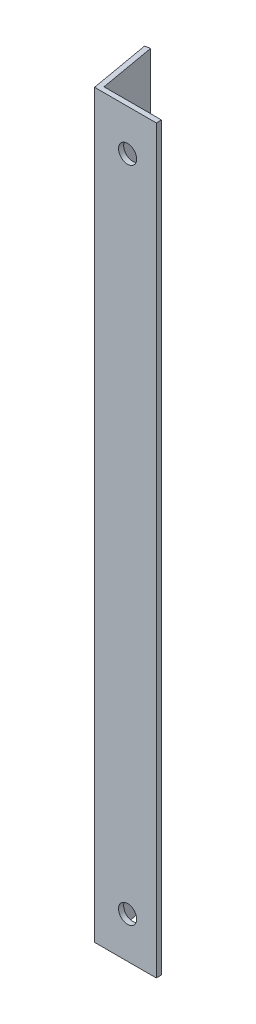
ISO-10303-21;
HEADER;
FILE_DESCRIPTION(('STEP AP214'),'2;1');
FILE_NAME('part.step','',(''),(''),'','','');
FILE_SCHEMA(('AUTOMOTIVE_DESIGN { 1 0 10303 214 1 1 1 1 }'));
ENDSEC;
DATA;
#1=APPLICATION_CONTEXT('core data for automotive mechanical design processes');
#2=APPLICATION_PROTOCOL_DEFINITION('international standard','automotive_design',2000,#1);
#3=PRODUCT_CONTEXT('',#1,'mechanical');
#4=PRODUCT('Part','Part','',(#3));
#5=PRODUCT_RELATED_PRODUCT_CATEGORY('part','',(#4));
#6=PRODUCT_DEFINITION_FORMATION('','',#4);
#7=PRODUCT_DEFINITION_CONTEXT('part definition',#1,'design');
#8=PRODUCT_DEFINITION('design','',#6,#7);
#9=PRODUCT_DEFINITION_SHAPE('','',#8);
#10=(LENGTH_UNIT() NAMED_UNIT(*) SI_UNIT(.MILLI.,.METRE.));
#11=(NAMED_UNIT(*) PLANE_ANGLE_UNIT() SI_UNIT($,.RADIAN.));
#12=(NAMED_UNIT(*) SI_UNIT($,.STERADIAN.) SOLID_ANGLE_UNIT());
#13=UNCERTAINTY_MEASURE_WITH_UNIT(LENGTH_MEASURE(1.E-05),#10,'distance_accuracy_value','');
#14=(GEOMETRIC_REPRESENTATION_CONTEXT(3) GLOBAL_UNCERTAINTY_ASSIGNED_CONTEXT((#13)) GLOBAL_UNIT_ASSIGNED_CONTEXT((#10,
#11,#12)) REPRESENTATION_CONTEXT('',''));
#15=CARTESIAN_POINT('',(0.,0.,0.));
#16=DIRECTION('',(0.,0.,1.));
#17=DIRECTION('',(1.,0.,0.));
#18=AXIS2_PLACEMENT_3D('',#15,#16,#17);
#19=CARTESIAN_POINT('',(0.,228.6,0.));
#20=DIRECTION('',(0.984807753012209,0.,-0.173648177666927));
#21=DIRECTION('',(-0.173648177666927,0.,-0.984807753012209));
#22=AXIS2_PLACEMENT_3D('',#19,#20,#21);
#23=PLANE('',#22);
#24=DIRECTION('',(0.173648177666927,0.,0.984807753012209));
#25=VECTOR('',#24,1.);
#26=CARTESIAN_POINT('',(0.,-228.6,0.));
#27=LINE('',#26,#25);
#28=CARTESIAN_POINT('',(-6.61599556910993,-228.6,-37.5211753897651));
#29=VERTEX_POINT('',#28);
#30=CARTESIAN_POINT('',(0.,-228.6,0.));
#31=VERTEX_POINT('',#30);
#32=EDGE_CURVE('E117',#29,#31,#27,.T.);
#33=ORIENTED_EDGE('',*,*,#32,.T.);
#34=DIRECTION('',(0.,-1.,0.));
#35=VECTOR('',#34,1.);
#36=CARTESIAN_POINT('',(0.,228.6,0.));
#37=LINE('',#36,#35);
#38=CARTESIAN_POINT('',(0.,228.6,0.));
#39=VERTEX_POINT('',#38);
#40=EDGE_CURVE('E11',#39,#31,#37,.T.);
#41=ORIENTED_EDGE('',*,*,#40,.F.);
#42=DIRECTION('',(0.173648177666927,0.,0.984807753012209));
#43=VECTOR('',#42,1.);
#44=CARTESIAN_POINT('',(0.,228.6,0.));
#45=LINE('',#44,#43);
#46=CARTESIAN_POINT('',(-6.61599556910993,228.6,-37.5211753897651));
#47=VERTEX_POINT('',#46);
#48=EDGE_CURVE('E128',#47,#39,#45,.T.);
#49=ORIENTED_EDGE('',*,*,#48,.F.);
#50=DIRECTION('',(0.,-1.,0.));
#51=VECTOR('',#50,1.);
#52=CARTESIAN_POINT('',(-6.61599556910993,228.6,-37.5211753897651));
#53=LINE('',#52,#51);
#54=EDGE_CURVE('E113',#47,#29,#53,.T.);
#55=ORIENTED_EDGE('',*,*,#54,.T.);
#56=EDGE_LOOP('',(#33,#41,#49,#55));
#57=FACE_BOUND('',#56,.T.);
#58=ADVANCED_FACE('F33',(#57),#23,.F.);
#59=CARTESIAN_POINT('',(0.,228.6,0.));
#60=DIRECTION('',(0.,0.,-1.));
#61=DIRECTION('',(-1.,0.,0.));
#62=AXIS2_PLACEMENT_3D('',#59,#60,#61);
#63=PLANE('',#62);
#64=CARTESIAN_POINT('',(20.3820706644939,-203.2,0.));
#65=DIRECTION('',(0.,0.,1.));
#66=DIRECTION('',(-1.,0.,0.));
#67=AXIS2_PLACEMENT_3D('',#64,#65,#66);
#68=CIRCLE('',#67,5.58799999999991);
#69=CARTESIAN_POINT('',(14.794070664494,-203.2,0.));
#70=VERTEX_POINT('',#69);
#71=EDGE_CURVE('E176',#70,#70,#68,.T.);
#72=ORIENTED_EDGE('',*,*,#71,.F.);
#73=EDGE_LOOP('',(#72));
#74=FACE_BOUND('',#73,.T.);
#75=CARTESIAN_POINT('',(20.3820706644939,203.2,0.));
#76=DIRECTION('',(0.,0.,-1.));
#77=DIRECTION('',(-1.,0.,0.));
#78=AXIS2_PLACEMENT_3D('',#75,#76,#77);
#79=CIRCLE('',#78,5.58799999999991);
#80=CARTESIAN_POINT('',(14.794070664494,203.2,0.));
#81=VERTEX_POINT('',#80);
#82=EDGE_CURVE('E121',#81,#81,#79,.T.);
#83=ORIENTED_EDGE('',*,*,#82,.T.);
#84=EDGE_LOOP('',(#83));
#85=FACE_BOUND('',#84,.T.);
#86=DIRECTION('',(1.,0.,0.));
#87=VECTOR('',#86,1.);
#88=CARTESIAN_POINT('',(0.,-228.6,0.));
#89=LINE('',#88,#87);
#90=CARTESIAN_POINT('',(38.1,-228.6,0.));
#91=VERTEX_POINT('',#90);
#92=EDGE_CURVE('E120',#31,#91,#89,.T.);
#93=ORIENTED_EDGE('',*,*,#92,.T.);
#94=DIRECTION('',(0.,-1.,0.));
#95=VECTOR('',#94,1.);
#96=CARTESIAN_POINT('',(38.1,228.6,0.));
#97=LINE('',#96,#95);
#98=CARTESIAN_POINT('',(38.1,228.6,0.));
#99=VERTEX_POINT('',#98);
#100=EDGE_CURVE('E41',#99,#91,#97,.T.);
#101=ORIENTED_EDGE('',*,*,#100,.F.);
#102=DIRECTION('',(1.,0.,0.));
#103=VECTOR('',#102,1.);
#104=CARTESIAN_POINT('',(0.,228.6,0.));
#105=LINE('',#104,#103);
#106=EDGE_CURVE('E86',#39,#99,#105,.T.);
#107=ORIENTED_EDGE('',*,*,#106,.F.);
#108=ORIENTED_EDGE('',*,*,#40,.T.);
#109=EDGE_LOOP('',(#93,#101,#107,#108));
#110=FACE_BOUND('',#109,.T.);
#111=ADVANCED_FACE('F152',(#74,#85,#110),#63,.F.);
#112=CARTESIAN_POINT('',(38.1,228.6,0.));
#113=DIRECTION('',(-1.,0.,0.));
#114=DIRECTION('',(0.,0.,1.));
#115=AXIS2_PLACEMENT_3D('',#112,#113,#114);
#116=PLANE('',#115);
#117=DIRECTION('',(0.,0.,-1.));
#118=VECTOR('',#117,1.);
#119=CARTESIAN_POINT('',(38.1,-228.6,0.));
#120=LINE('',#119,#118);
#121=CARTESIAN_POINT('',(38.1,-228.6,-3.175));
#122=VERTEX_POINT('',#121);
#123=EDGE_CURVE('E123',#91,#122,#120,.T.);
#124=ORIENTED_EDGE('',*,*,#123,.T.);
#125=DIRECTION('',(0.,-1.,0.));
#126=VECTOR('',#125,1.);
#127=CARTESIAN_POINT('',(38.1,228.6,-3.175));
#128=LINE('',#127,#126);
#129=CARTESIAN_POINT('',(38.1,228.6,-3.175));
#130=VERTEX_POINT('',#129);
#131=EDGE_CURVE('E108',#130,#122,#128,.T.);
#132=ORIENTED_EDGE('',*,*,#131,.F.);
#133=DIRECTION('',(0.,0.,-1.));
#134=VECTOR('',#133,1.);
#135=CARTESIAN_POINT('',(38.1,228.6,0.));
#136=LINE('',#135,#134);
#137=EDGE_CURVE('E99',#99,#130,#136,.T.);
#138=ORIENTED_EDGE('',*,*,#137,.F.);
#139=ORIENTED_EDGE('',*,*,#100,.T.);
#140=EDGE_LOOP('',(#124,#132,#138,#139));
#141=FACE_BOUND('',#140,.T.);
#142=ADVANCED_FACE('F134',(#141),#116,.F.);
#143=CARTESIAN_POINT('',(2.66414132898787,228.6,-3.175));
#144=DIRECTION('',(0.,0.,1.));
#145=DIRECTION('',(1.,0.,0.));
#146=AXIS2_PLACEMENT_3D('',#143,#144,#145);
#147=PLANE('',#146);
#148=CARTESIAN_POINT('',(20.3820706644939,-203.2,-3.175));
#149=DIRECTION('',(0.,0.,1.));
#150=DIRECTION('',(-1.,0.,0.));
#151=AXIS2_PLACEMENT_3D('',#148,#149,#150);
#152=CIRCLE('',#151,5.58799999999991);
#153=CARTESIAN_POINT('',(14.794070664494,-203.2,-3.175));
#154=VERTEX_POINT('',#153);
#155=EDGE_CURVE('E171',#154,#154,#152,.T.);
#156=ORIENTED_EDGE('',*,*,#155,.T.);
#157=EDGE_LOOP('',(#156));
#158=FACE_BOUND('',#157,.T.);
#159=CARTESIAN_POINT('',(20.3820706644939,203.2,-3.175));
#160=DIRECTION('',(0.,0.,-1.));
#161=DIRECTION('',(-1.,0.,0.));
#162=AXIS2_PLACEMENT_3D('',#159,#160,#161);
#163=CIRCLE('',#162,5.58799999999991);
#164=CARTESIAN_POINT('',(14.794070664494,203.2,-3.175));
#165=VERTEX_POINT('',#164);
#166=EDGE_CURVE('E174',#165,#165,#163,.T.);
#167=ORIENTED_EDGE('',*,*,#166,.F.);
#168=EDGE_LOOP('',(#167));
#169=FACE_BOUND('',#168,.T.);
#170=DIRECTION('',(-1.,0.,0.));
#171=VECTOR('',#170,1.);
#172=CARTESIAN_POINT('',(2.66414132898787,-228.6,-3.175));
#173=LINE('',#172,#171);
#174=CARTESIAN_POINT('',(2.66414132898787,-228.6,-3.175));
#175=VERTEX_POINT('',#174);
#176=EDGE_CURVE('E107',#122,#175,#173,.T.);
#177=ORIENTED_EDGE('',*,*,#176,.T.);
#178=DIRECTION('',(0.,-1.,0.));
#179=VECTOR('',#178,1.);
#180=CARTESIAN_POINT('',(2.66414132898787,228.6,-3.175));
#181=LINE('',#180,#179);
#182=CARTESIAN_POINT('',(2.66414132898787,228.6,-3.175));
#183=VERTEX_POINT('',#182);
#184=EDGE_CURVE('E104',#183,#175,#181,.T.);
#185=ORIENTED_EDGE('',*,*,#184,.F.);
#186=DIRECTION('',(-1.,0.,0.));
#187=VECTOR('',#186,1.);
#188=CARTESIAN_POINT('',(2.66414132898787,228.6,-3.175));
#189=LINE('',#188,#187);
#190=EDGE_CURVE('E93',#130,#183,#189,.T.);
#191=ORIENTED_EDGE('',*,*,#190,.F.);
#192=ORIENTED_EDGE('',*,*,#131,.T.);
#193=EDGE_LOOP('',(#177,#185,#191,#192));
#194=FACE_BOUND('',#193,.T.);
#195=ADVANCED_FACE('F105',(#158,#169,#194),#147,.F.);
#196=CARTESIAN_POINT('',(-3.48923095329616,228.6,-38.0725083538576));
#197=DIRECTION('',(-0.984807753012208,0.,0.173648177666927));
#198=DIRECTION('',(0.173648177666927,0.,0.984807753012209));
#199=AXIS2_PLACEMENT_3D('',#196,#197,#198);
#200=PLANE('',#199);
#201=DIRECTION('',(-0.173648177666927,0.,-0.984807753012209));
#202=VECTOR('',#201,1.);
#203=CARTESIAN_POINT('',(-3.48923095329616,-228.6,-38.0725083538576));
#204=LINE('',#203,#202);
#205=CARTESIAN_POINT('',(-3.48923095329616,-228.6,-38.0725083538576));
#206=VERTEX_POINT('',#205);
#207=EDGE_CURVE('E72',#175,#206,#204,.T.);
#208=ORIENTED_EDGE('',*,*,#207,.T.);
#209=DIRECTION('',(0.,-1.,0.));
#210=VECTOR('',#209,1.);
#211=CARTESIAN_POINT('',(-3.48923095329616,228.6,-38.0725083538576));
#212=LINE('',#211,#210);
#213=CARTESIAN_POINT('',(-3.48923095329616,228.6,-38.0725083538576));
#214=VERTEX_POINT('',#213);
#215=EDGE_CURVE('E109',#214,#206,#212,.T.);
#216=ORIENTED_EDGE('',*,*,#215,.F.);
#217=DIRECTION('',(-0.173648177666927,0.,-0.984807753012209));
#218=VECTOR('',#217,1.);
#219=CARTESIAN_POINT('',(-3.48923095329616,228.6,-38.0725083538576));
#220=LINE('',#219,#218);
#221=EDGE_CURVE('E97',#183,#214,#220,.T.);
#222=ORIENTED_EDGE('',*,*,#221,.F.);
#223=ORIENTED_EDGE('',*,*,#184,.T.);
#224=EDGE_LOOP('',(#208,#216,#222,#223));
#225=FACE_BOUND('',#224,.T.);
#226=ADVANCED_FACE('F111',(#225),#200,.F.);
#227=CARTESIAN_POINT('',(-6.61599556910993,228.6,-37.5211753897651));
#228=DIRECTION('',(0.173648177666928,0.,0.984807753012209));
#229=DIRECTION('',(0.984807753012209,0.,-0.173648177666928));
#230=AXIS2_PLACEMENT_3D('',#227,#228,#229);
#231=PLANE('',#230);
#232=DIRECTION('',(-0.984807753012209,0.,0.173648177666928));
#233=VECTOR('',#232,1.);
#234=CARTESIAN_POINT('',(-6.61599556910993,-228.6,-37.5211753897651));
#235=LINE('',#234,#233);
#236=EDGE_CURVE('E78',#206,#29,#235,.T.);
#237=ORIENTED_EDGE('',*,*,#236,.T.);
#238=ORIENTED_EDGE('',*,*,#54,.F.);
#239=DIRECTION('',(-0.984807753012209,0.,0.173648177666928));
#240=VECTOR('',#239,1.);
#241=CARTESIAN_POINT('',(-6.61599556910993,228.6,-37.5211753897651));
#242=LINE('',#241,#240);
#243=EDGE_CURVE('E49',#214,#47,#242,.T.);
#244=ORIENTED_EDGE('',*,*,#243,.F.);
#245=ORIENTED_EDGE('',*,*,#215,.T.);
#246=EDGE_LOOP('',(#237,#238,#244,#245));
#247=FACE_BOUND('',#246,.T.);
#248=ADVANCED_FACE('F141',(#247),#231,.F.);
#249=CARTESIAN_POINT('',(0.,228.6,0.));
#250=DIRECTION('',(0.,-1.,0.));
#251=DIRECTION('',(0.,0.,-1.));
#252=AXIS2_PLACEMENT_3D('',#249,#250,#251);
#253=PLANE('',#252);
#254=ORIENTED_EDGE('',*,*,#48,.T.);
#255=ORIENTED_EDGE('',*,*,#106,.T.);
#256=ORIENTED_EDGE('',*,*,#137,.T.);
#257=ORIENTED_EDGE('',*,*,#190,.T.);
#258=ORIENTED_EDGE('',*,*,#221,.T.);
#259=ORIENTED_EDGE('',*,*,#243,.T.);
#260=EDGE_LOOP('',(#254,#255,#256,#257,#258,#259));
#261=FACE_BOUND('',#260,.T.);
#262=ADVANCED_FACE('F95',(#261),#253,.F.);
#263=CARTESIAN_POINT('',(0.,-228.6,0.));
#264=DIRECTION('',(0.,-1.,0.));
#265=DIRECTION('',(0.,0.,-1.));
#266=AXIS2_PLACEMENT_3D('',#263,#264,#265);
#267=PLANE('',#266);
#268=ORIENTED_EDGE('',*,*,#32,.F.);
#269=ORIENTED_EDGE('',*,*,#236,.F.);
#270=ORIENTED_EDGE('',*,*,#207,.F.);
#271=ORIENTED_EDGE('',*,*,#176,.F.);
#272=ORIENTED_EDGE('',*,*,#123,.F.);
#273=ORIENTED_EDGE('',*,*,#92,.F.);
#274=EDGE_LOOP('',(#268,#269,#270,#271,#272,#273));
#275=FACE_BOUND('',#274,.T.);
#276=ADVANCED_FACE('F137',(#275),#267,.T.);
#277=CARTESIAN_POINT('',(20.3820706644939,203.2,0.));
#278=DIRECTION('',(0.,0.,-1.));
#279=DIRECTION('',(-1.,0.,0.));
#280=AXIS2_PLACEMENT_3D('',#277,#278,#279);
#281=CYLINDRICAL_SURFACE('',#280,5.58799999999991);
#282=ORIENTED_EDGE('',*,*,#82,.F.);
#283=EDGE_LOOP('',(#282));
#284=FACE_BOUND('',#283,.T.);
#285=ORIENTED_EDGE('',*,*,#166,.T.);
#286=EDGE_LOOP('',(#285));
#287=FACE_BOUND('',#286,.T.);
#288=ADVANCED_FACE('F189',(#284,#287),#281,.F.);
#289=CARTESIAN_POINT('',(20.3820706644939,-203.2,0.));
#290=DIRECTION('',(0.,0.,-1.));
#291=DIRECTION('',(-1.,0.,0.));
#292=AXIS2_PLACEMENT_3D('',#289,#290,#291);
#293=CYLINDRICAL_SURFACE('',#292,5.58799999999991);
#294=ORIENTED_EDGE('',*,*,#71,.T.);
#295=EDGE_LOOP('',(#294));
#296=FACE_BOUND('',#295,.T.);
#297=ORIENTED_EDGE('',*,*,#155,.F.);
#298=EDGE_LOOP('',(#297));
#299=FACE_BOUND('',#298,.T.);
#300=ADVANCED_FACE('F186',(#296,#299),#293,.F.);
#301=CLOSED_SHELL('',(#58,#111,#142,#195,#226,#248,#262,#276,#288,#300));
#302=MANIFOLD_SOLID_BREP('B2',#301);
#303=ADVANCED_BREP_SHAPE_REPRESENTATION('',(#18,#302),#14);
#304=SHAPE_DEFINITION_REPRESENTATION(#9,#303);
ENDSEC;
END-ISO-10303-21;
